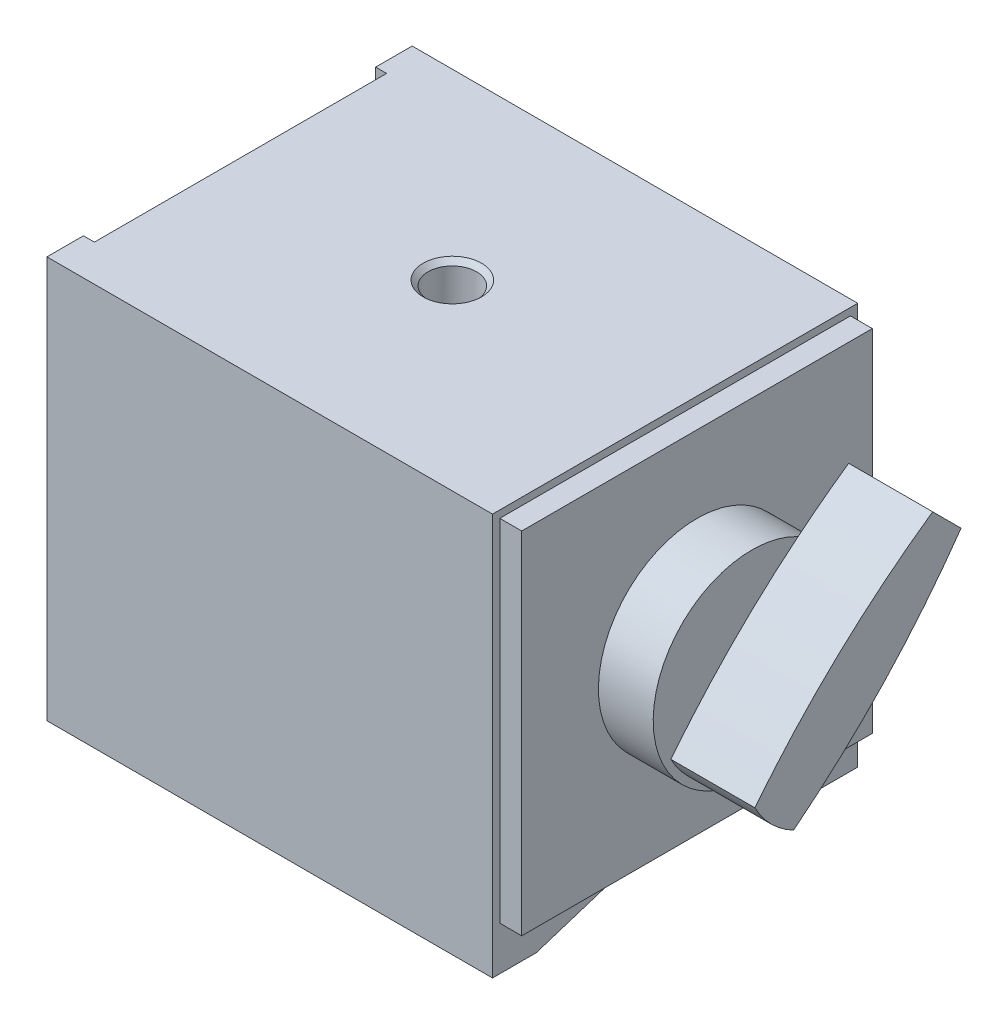
ISO-10303-21;
HEADER;
FILE_DESCRIPTION(('STEP AP214'),'2;1');
FILE_NAME('part.step','',(''),(''),'','','');
FILE_SCHEMA(('AUTOMOTIVE_DESIGN { 1 0 10303 214 1 1 1 1 }'));
ENDSEC;
DATA;
#1=APPLICATION_CONTEXT('core data for automotive mechanical design processes');
#2=APPLICATION_PROTOCOL_DEFINITION('international standard','automotive_design',2000,#1);
#3=PRODUCT_CONTEXT('',#1,'mechanical');
#4=PRODUCT('Part','Part','',(#3));
#5=PRODUCT_RELATED_PRODUCT_CATEGORY('part','',(#4));
#6=PRODUCT_DEFINITION_FORMATION('','',#4);
#7=PRODUCT_DEFINITION_CONTEXT('part definition',#1,'design');
#8=PRODUCT_DEFINITION('design','',#6,#7);
#9=PRODUCT_DEFINITION_SHAPE('','',#8);
#10=(LENGTH_UNIT() NAMED_UNIT(*) SI_UNIT(.MILLI.,.METRE.));
#11=(NAMED_UNIT(*) PLANE_ANGLE_UNIT() SI_UNIT($,.RADIAN.));
#12=(NAMED_UNIT(*) SI_UNIT($,.STERADIAN.) SOLID_ANGLE_UNIT());
#13=UNCERTAINTY_MEASURE_WITH_UNIT(LENGTH_MEASURE(1.E-05),#10,'distance_accuracy_value','');
#14=(GEOMETRIC_REPRESENTATION_CONTEXT(3) GLOBAL_UNCERTAINTY_ASSIGNED_CONTEXT((#13)) GLOBAL_UNIT_ASSIGNED_CONTEXT((#10,
#11,#12)) REPRESENTATION_CONTEXT('',''));
#15=CARTESIAN_POINT('',(0.,0.,0.));
#16=DIRECTION('',(0.,0.,1.));
#17=DIRECTION('',(1.,0.,0.));
#18=AXIS2_PLACEMENT_3D('',#15,#16,#17);
#19=CARTESIAN_POINT('',(-29.,0.,20.));
#20=DIRECTION('',(-1.,0.,0.));
#21=DIRECTION('',(0.,1.,0.));
#22=AXIS2_PLACEMENT_3D('',#19,#20,#21);
#23=PLANE('',#22);
#24=DIRECTION('',(0.,-0.304775727103784,0.952424147199324));
#25=VECTOR('',#24,1.);
#26=CARTESIAN_POINT('',(-29.,4.00000000000001,6.5));
#27=LINE('',#26,#25);
#28=CARTESIAN_POINT('',(-29.,0.,19.));
#29=VERTEX_POINT('',#28);
#30=CARTESIAN_POINT('',(-29.,4.00000000000001,6.5));
#31=VERTEX_POINT('',#30);
#32=EDGE_CURVE('E175',#29,#31,#27,.F.);
#33=ORIENTED_EDGE('',*,*,#32,.F.);
#34=DIRECTION('',(0.,0.,1.));
#35=VECTOR('',#34,1.);
#36=CARTESIAN_POINT('',(-29.,0.,19.));
#37=LINE('',#36,#35);
#38=CARTESIAN_POINT('',(-29.,0.,20.));
#39=VERTEX_POINT('',#38);
#40=EDGE_CURVE('E190',#29,#39,#37,.T.);
#41=ORIENTED_EDGE('',*,*,#40,.T.);
#42=DIRECTION('',(0.,1.,0.));
#43=VECTOR('',#42,1.);
#44=CARTESIAN_POINT('',(-29.,0.,20.));
#45=LINE('',#44,#43);
#46=CARTESIAN_POINT('',(-29.,55.,20.));
#47=VERTEX_POINT('',#46);
#48=EDGE_CURVE('E199',#47,#39,#45,.F.);
#49=ORIENTED_EDGE('',*,*,#48,.F.);
#50=DIRECTION('',(0.,0.,-1.));
#51=VECTOR('',#50,1.);
#52=CARTESIAN_POINT('',(-29.,55.,20.));
#53=LINE('',#52,#51);
#54=CARTESIAN_POINT('',(-29.,55.,-20.));
#55=VERTEX_POINT('',#54);
#56=EDGE_CURVE('E201',#55,#47,#53,.F.);
#57=ORIENTED_EDGE('',*,*,#56,.F.);
#58=DIRECTION('',(0.,-1.,0.));
#59=VECTOR('',#58,1.);
#60=CARTESIAN_POINT('',(-29.,55.,-20.));
#61=LINE('',#60,#59);
#62=CARTESIAN_POINT('',(-29.,0.,-20.));
#63=VERTEX_POINT('',#62);
#64=EDGE_CURVE('E211',#55,#63,#61,.T.);
#65=ORIENTED_EDGE('',*,*,#64,.T.);
#66=DIRECTION('',(0.,0.,1.));
#67=VECTOR('',#66,1.);
#68=CARTESIAN_POINT('',(-29.,0.,-20.));
#69=LINE('',#68,#67);
#70=CARTESIAN_POINT('',(-29.,0.,-19.));
#71=VERTEX_POINT('',#70);
#72=EDGE_CURVE('E216',#63,#71,#69,.T.);
#73=ORIENTED_EDGE('',*,*,#72,.T.);
#74=DIRECTION('',(0.,0.304775727103784,0.952424147199324));
#75=VECTOR('',#74,1.);
#76=CARTESIAN_POINT('',(-29.,0.,-19.));
#77=LINE('',#76,#75);
#78=CARTESIAN_POINT('',(-29.,3.99999999999999,-6.5));
#79=VERTEX_POINT('',#78);
#80=EDGE_CURVE('E221',#79,#71,#77,.F.);
#81=ORIENTED_EDGE('',*,*,#80,.F.);
#82=DIRECTION('',(0.,1.,0.));
#83=VECTOR('',#82,1.);
#84=CARTESIAN_POINT('',(-29.,4.,-6.5));
#85=LINE('',#84,#83);
#86=CARTESIAN_POINT('',(-29.,5.,-6.5));
#87=VERTEX_POINT('',#86);
#88=EDGE_CURVE('E225',#87,#79,#85,.F.);
#89=ORIENTED_EDGE('',*,*,#88,.F.);
#90=DIRECTION('',(0.,0.,1.));
#91=VECTOR('',#90,1.);
#92=CARTESIAN_POINT('',(-29.,5.,-6.5));
#93=LINE('',#92,#91);
#94=CARTESIAN_POINT('',(-29.,5.,6.5));
#95=VERTEX_POINT('',#94);
#96=EDGE_CURVE('E230',#95,#87,#93,.F.);
#97=ORIENTED_EDGE('',*,*,#96,.F.);
#98=DIRECTION('',(0.,-1.,0.));
#99=VECTOR('',#98,1.);
#100=CARTESIAN_POINT('',(-29.,5.,6.5));
#101=LINE('',#100,#99);
#102=EDGE_CURVE('E192',#31,#95,#101,.F.);
#103=ORIENTED_EDGE('',*,*,#102,.F.);
#104=EDGE_LOOP('',(#33,#41,#49,#57,#65,#73,#81,#89,#97,#103));
#105=FACE_BOUND('',#104,.T.);
#106=ADVANCED_FACE('F17',(#105),#23,.T.);
#107=CARTESIAN_POINT('',(30.5,0.,-25.));
#108=DIRECTION('',(1.,0.,0.));
#109=DIRECTION('',(0.,1.,0.));
#110=AXIS2_PLACEMENT_3D('',#107,#108,#109);
#111=PLANE('',#110);
#112=DIRECTION('',(0.,0.304775727103784,-0.952424147199324));
#113=VECTOR('',#112,1.);
#114=CARTESIAN_POINT('',(30.5,0.,19.));
#115=LINE('',#114,#113);
#116=CARTESIAN_POINT('',(30.5,4.,6.49999999999999));
#117=VERTEX_POINT('',#116);
#118=CARTESIAN_POINT('',(30.5,0.,19.));
#119=VERTEX_POINT('',#118);
#120=EDGE_CURVE('E178',#117,#119,#115,.F.);
#121=ORIENTED_EDGE('',*,*,#120,.F.);
#122=DIRECTION('',(0.,1.,0.));
#123=VECTOR('',#122,1.);
#124=CARTESIAN_POINT('',(30.5,4.,6.5));
#125=LINE('',#124,#123);
#126=CARTESIAN_POINT('',(30.5,5.,6.5));
#127=VERTEX_POINT('',#126);
#128=EDGE_CURVE('E240',#127,#117,#125,.F.);
#129=ORIENTED_EDGE('',*,*,#128,.F.);
#130=DIRECTION('',(0.,0.,-1.));
#131=VECTOR('',#130,1.);
#132=CARTESIAN_POINT('',(30.5,5.,6.5));
#133=LINE('',#132,#131);
#134=CARTESIAN_POINT('',(30.5,5.,-6.5));
#135=VERTEX_POINT('',#134);
#136=EDGE_CURVE('E245',#135,#127,#133,.F.);
#137=ORIENTED_EDGE('',*,*,#136,.F.);
#138=DIRECTION('',(0.,-1.,0.));
#139=VECTOR('',#138,1.);
#140=CARTESIAN_POINT('',(30.5,5.,-6.5));
#141=LINE('',#140,#139);
#142=CARTESIAN_POINT('',(30.5,4.,-6.5));
#143=VERTEX_POINT('',#142);
#144=EDGE_CURVE('E250',#143,#135,#141,.F.);
#145=ORIENTED_EDGE('',*,*,#144,.F.);
#146=DIRECTION('',(0.,-0.304775727103784,-0.952424147199324));
#147=VECTOR('',#146,1.);
#148=CARTESIAN_POINT('',(30.5,4.00000000000001,-6.5));
#149=LINE('',#148,#147);
#150=CARTESIAN_POINT('',(30.5,0.,-19.));
#151=VERTEX_POINT('',#150);
#152=EDGE_CURVE('E255',#151,#143,#149,.F.);
#153=ORIENTED_EDGE('',*,*,#152,.F.);
#154=DIRECTION('',(0.,0.,-1.));
#155=VECTOR('',#154,1.);
#156=CARTESIAN_POINT('',(30.5,0.,-19.));
#157=LINE('',#156,#155);
#158=CARTESIAN_POINT('',(30.5,0.,-25.));
#159=VERTEX_POINT('',#158);
#160=EDGE_CURVE('E259',#151,#159,#157,.T.);
#161=ORIENTED_EDGE('',*,*,#160,.T.);
#162=DIRECTION('',(0.,1.,0.));
#163=VECTOR('',#162,1.);
#164=CARTESIAN_POINT('',(30.5,0.,-25.));
#165=LINE('',#164,#163);
#166=CARTESIAN_POINT('',(30.5,55.,-25.));
#167=VERTEX_POINT('',#166);
#168=EDGE_CURVE('E264',#167,#159,#165,.F.);
#169=ORIENTED_EDGE('',*,*,#168,.F.);
#170=DIRECTION('',(0.,0.,1.));
#171=VECTOR('',#170,1.);
#172=CARTESIAN_POINT('',(30.5,55.,-25.));
#173=LINE('',#172,#171);
#174=CARTESIAN_POINT('',(30.5,55.,25.));
#175=VERTEX_POINT('',#174);
#176=EDGE_CURVE('E268',#175,#167,#173,.F.);
#177=ORIENTED_EDGE('',*,*,#176,.F.);
#178=DIRECTION('',(0.,-1.,0.));
#179=VECTOR('',#178,1.);
#180=CARTESIAN_POINT('',(30.5,55.,25.));
#181=LINE('',#180,#179);
#182=CARTESIAN_POINT('',(30.5,0.,25.));
#183=VERTEX_POINT('',#182);
#184=EDGE_CURVE('E272',#175,#183,#181,.T.);
#185=ORIENTED_EDGE('',*,*,#184,.T.);
#186=DIRECTION('',(0.,0.,-1.));
#187=VECTOR('',#186,1.);
#188=CARTESIAN_POINT('',(30.5,0.,25.));
#189=LINE('',#188,#187);
#190=EDGE_CURVE('E277',#183,#119,#189,.T.);
#191=ORIENTED_EDGE('',*,*,#190,.T.);
#192=EDGE_LOOP('',(#121,#129,#137,#145,#153,#161,#169,#177,#185,#191));
#193=FACE_BOUND('',#192,.T.);
#194=DIRECTION('',(0.,0.,-1.));
#195=VECTOR('',#194,1.);
#196=CARTESIAN_POINT('',(30.5,54.,24.));
#197=LINE('',#196,#195);
#198=CARTESIAN_POINT('',(30.5,54.,24.));
#199=VERTEX_POINT('',#198);
#200=CARTESIAN_POINT('',(30.5,54.,-24.));
#201=VERTEX_POINT('',#200);
#202=EDGE_CURVE('E281',#199,#201,#197,.T.);
#203=ORIENTED_EDGE('',*,*,#202,.T.);
#204=DIRECTION('',(0.,-1.,0.));
#205=VECTOR('',#204,1.);
#206=CARTESIAN_POINT('',(30.5,54.,-24.));
#207=LINE('',#206,#205);
#208=CARTESIAN_POINT('',(30.5,6.,-24.));
#209=VERTEX_POINT('',#208);
#210=EDGE_CURVE('E286',#201,#209,#207,.T.);
#211=ORIENTED_EDGE('',*,*,#210,.T.);
#212=DIRECTION('',(0.,0.,1.));
#213=VECTOR('',#212,1.);
#214=CARTESIAN_POINT('',(30.5,6.,-24.));
#215=LINE('',#214,#213);
#216=CARTESIAN_POINT('',(30.5,6.,24.));
#217=VERTEX_POINT('',#216);
#218=EDGE_CURVE('E291',#217,#209,#215,.F.);
#219=ORIENTED_EDGE('',*,*,#218,.F.);
#220=DIRECTION('',(0.,1.,0.));
#221=VECTOR('',#220,1.);
#222=CARTESIAN_POINT('',(30.5,6.,24.));
#223=LINE('',#222,#221);
#224=EDGE_CURVE('E184',#199,#217,#223,.F.);
#225=ORIENTED_EDGE('',*,*,#224,.F.);
#226=EDGE_LOOP('',(#203,#211,#219,#225));
#227=FACE_BOUND('',#226,.T.);
#228=ADVANCED_FACE('F536',(#193,#227),#111,.T.);
#229=CARTESIAN_POINT('',(-30.5,0.,19.));
#230=DIRECTION('',(0.,-1.,0.));
#231=DIRECTION('',(1.,0.,0.));
#232=AXIS2_PLACEMENT_3D('',#229,#230,#231);
#233=PLANE('',#232);
#234=DIRECTION('',(1.,0.,0.));
#235=VECTOR('',#234,1.);
#236=CARTESIAN_POINT('',(-29.,0.,19.));
#237=LINE('',#236,#235);
#238=EDGE_CURVE('E172',#119,#29,#237,.F.);
#239=ORIENTED_EDGE('',*,*,#238,.F.);
#240=ORIENTED_EDGE('',*,*,#190,.F.);
#241=DIRECTION('',(-1.,0.,0.));
#242=VECTOR('',#241,1.);
#243=CARTESIAN_POINT('',(30.5,0.,25.));
#244=LINE('',#243,#242);
#245=CARTESIAN_POINT('',(-30.5,0.,25.));
#246=VERTEX_POINT('',#245);
#247=EDGE_CURVE('E183',#246,#183,#244,.F.);
#248=ORIENTED_EDGE('',*,*,#247,.F.);
#249=DIRECTION('',(0.,0.,-1.));
#250=VECTOR('',#249,1.);
#251=CARTESIAN_POINT('',(-30.5,0.,25.));
#252=LINE('',#251,#250);
#253=CARTESIAN_POINT('',(-30.5,0.,20.));
#254=VERTEX_POINT('',#253);
#255=EDGE_CURVE('E304',#254,#246,#252,.F.);
#256=ORIENTED_EDGE('',*,*,#255,.F.);
#257=DIRECTION('',(1.,0.,0.));
#258=VECTOR('',#257,1.);
#259=CARTESIAN_POINT('',(-30.5,0.,20.));
#260=LINE('',#259,#258);
#261=EDGE_CURVE('E198',#39,#254,#260,.F.);
#262=ORIENTED_EDGE('',*,*,#261,.F.);
#263=ORIENTED_EDGE('',*,*,#40,.F.);
#264=EDGE_LOOP('',(#239,#240,#248,#256,#262,#263));
#265=FACE_BOUND('',#264,.T.);
#266=ADVANCED_FACE('F195',(#265),#233,.T.);
#267=CARTESIAN_POINT('',(-30.5,0.,-25.));
#268=DIRECTION('',(0.,-1.,0.));
#269=DIRECTION('',(1.,0.,0.));
#270=AXIS2_PLACEMENT_3D('',#267,#268,#269);
#271=PLANE('',#270);
#272=DIRECTION('',(-1.,0.,0.));
#273=VECTOR('',#272,1.);
#274=CARTESIAN_POINT('',(30.5,0.,-19.));
#275=LINE('',#274,#273);
#276=EDGE_CURVE('E312',#151,#71,#275,.T.);
#277=ORIENTED_EDGE('',*,*,#276,.T.);
#278=ORIENTED_EDGE('',*,*,#72,.F.);
#279=DIRECTION('',(-1.,0.,0.));
#280=VECTOR('',#279,1.);
#281=CARTESIAN_POINT('',(-29.,0.,-20.));
#282=LINE('',#281,#280);
#283=CARTESIAN_POINT('',(-30.5,0.,-20.));
#284=VERTEX_POINT('',#283);
#285=EDGE_CURVE('E317',#284,#63,#282,.F.);
#286=ORIENTED_EDGE('',*,*,#285,.F.);
#287=DIRECTION('',(0.,0.,-1.));
#288=VECTOR('',#287,1.);
#289=CARTESIAN_POINT('',(-30.5,0.,-20.));
#290=LINE('',#289,#288);
#291=CARTESIAN_POINT('',(-30.5,0.,-25.));
#292=VERTEX_POINT('',#291);
#293=EDGE_CURVE('E321',#292,#284,#290,.F.);
#294=ORIENTED_EDGE('',*,*,#293,.F.);
#295=DIRECTION('',(1.,0.,0.));
#296=VECTOR('',#295,1.);
#297=CARTESIAN_POINT('',(-30.5,0.,-25.));
#298=LINE('',#297,#296);
#299=EDGE_CURVE('E326',#159,#292,#298,.F.);
#300=ORIENTED_EDGE('',*,*,#299,.F.);
#301=ORIENTED_EDGE('',*,*,#160,.F.);
#302=EDGE_LOOP('',(#277,#278,#286,#294,#300,#301));
#303=FACE_BOUND('',#302,.T.);
#304=ADVANCED_FACE('F546',(#303),#271,.T.);
#305=CARTESIAN_POINT('',(-30.5,0.,-25.));
#306=DIRECTION('',(0.,0.,-1.));
#307=DIRECTION('',(0.,1.,0.));
#308=AXIS2_PLACEMENT_3D('',#305,#306,#307);
#309=PLANE('',#308);
#310=ORIENTED_EDGE('',*,*,#299,.T.);
#311=DIRECTION('',(0.,1.,0.));
#312=VECTOR('',#311,1.);
#313=CARTESIAN_POINT('',(-30.5,0.,-25.));
#314=LINE('',#313,#312);
#315=CARTESIAN_POINT('',(-30.5,55.,-25.));
#316=VERTEX_POINT('',#315);
#317=EDGE_CURVE('E331',#316,#292,#314,.F.);
#318=ORIENTED_EDGE('',*,*,#317,.F.);
#319=DIRECTION('',(1.,0.,0.));
#320=VECTOR('',#319,1.);
#321=CARTESIAN_POINT('',(-30.5,55.,-25.));
#322=LINE('',#321,#320);
#323=EDGE_CURVE('E335',#167,#316,#322,.F.);
#324=ORIENTED_EDGE('',*,*,#323,.F.);
#325=ORIENTED_EDGE('',*,*,#168,.T.);
#326=EDGE_LOOP('',(#310,#318,#324,#325));
#327=FACE_BOUND('',#326,.T.);
#328=ADVANCED_FACE('F549',(#327),#309,.T.);
#329=CARTESIAN_POINT('',(-30.5,0.,-20.));
#330=DIRECTION('',(-1.,0.,0.));
#331=DIRECTION('',(0.,1.,0.));
#332=AXIS2_PLACEMENT_3D('',#329,#330,#331);
#333=PLANE('',#332);
#334=ORIENTED_EDGE('',*,*,#293,.T.);
#335=DIRECTION('',(0.,1.,0.));
#336=VECTOR('',#335,1.);
#337=CARTESIAN_POINT('',(-30.5,0.,-20.));
#338=LINE('',#337,#336);
#339=CARTESIAN_POINT('',(-30.5,55.,-20.));
#340=VERTEX_POINT('',#339);
#341=EDGE_CURVE('E339',#340,#284,#338,.F.);
#342=ORIENTED_EDGE('',*,*,#341,.F.);
#343=DIRECTION('',(0.,0.,-1.));
#344=VECTOR('',#343,1.);
#345=CARTESIAN_POINT('',(-30.5,55.,-20.));
#346=LINE('',#345,#344);
#347=EDGE_CURVE('E343',#316,#340,#346,.F.);
#348=ORIENTED_EDGE('',*,*,#347,.F.);
#349=ORIENTED_EDGE('',*,*,#317,.T.);
#350=EDGE_LOOP('',(#334,#342,#348,#349));
#351=FACE_BOUND('',#350,.T.);
#352=ADVANCED_FACE('F553',(#351),#333,.T.);
#353=CARTESIAN_POINT('',(-29.,0.,-20.));
#354=DIRECTION('',(0.,0.,1.));
#355=DIRECTION('',(0.,1.,0.));
#356=AXIS2_PLACEMENT_3D('',#353,#354,#355);
#357=PLANE('',#356);
#358=ORIENTED_EDGE('',*,*,#285,.T.);
#359=ORIENTED_EDGE('',*,*,#64,.F.);
#360=DIRECTION('',(-1.,0.,0.));
#361=VECTOR('',#360,1.);
#362=CARTESIAN_POINT('',(-29.,55.,-20.));
#363=LINE('',#362,#361);
#364=EDGE_CURVE('E347',#340,#55,#363,.F.);
#365=ORIENTED_EDGE('',*,*,#364,.F.);
#366=ORIENTED_EDGE('',*,*,#341,.T.);
#367=EDGE_LOOP('',(#358,#359,#365,#366));
#368=FACE_BOUND('',#367,.T.);
#369=ADVANCED_FACE('F557',(#368),#357,.T.);
#370=CARTESIAN_POINT('',(-30.5,0.,20.));
#371=DIRECTION('',(0.,0.,-1.));
#372=DIRECTION('',(0.,1.,0.));
#373=AXIS2_PLACEMENT_3D('',#370,#371,#372);
#374=PLANE('',#373);
#375=ORIENTED_EDGE('',*,*,#261,.T.);
#376=DIRECTION('',(0.,1.,0.));
#377=VECTOR('',#376,1.);
#378=CARTESIAN_POINT('',(-30.5,0.,20.));
#379=LINE('',#378,#377);
#380=CARTESIAN_POINT('',(-30.5,55.,20.));
#381=VERTEX_POINT('',#380);
#382=EDGE_CURVE('E351',#381,#254,#379,.F.);
#383=ORIENTED_EDGE('',*,*,#382,.F.);
#384=DIRECTION('',(1.,0.,0.));
#385=VECTOR('',#384,1.);
#386=CARTESIAN_POINT('',(-30.5,55.,20.));
#387=LINE('',#386,#385);
#388=EDGE_CURVE('E355',#47,#381,#387,.F.);
#389=ORIENTED_EDGE('',*,*,#388,.F.);
#390=ORIENTED_EDGE('',*,*,#48,.T.);
#391=EDGE_LOOP('',(#375,#383,#389,#390));
#392=FACE_BOUND('',#391,.T.);
#393=ADVANCED_FACE('F561',(#392),#374,.T.);
#394=CARTESIAN_POINT('',(-30.5,0.,25.));
#395=DIRECTION('',(-1.,0.,0.));
#396=DIRECTION('',(0.,1.,0.));
#397=AXIS2_PLACEMENT_3D('',#394,#395,#396);
#398=PLANE('',#397);
#399=ORIENTED_EDGE('',*,*,#255,.T.);
#400=DIRECTION('',(0.,1.,0.));
#401=VECTOR('',#400,1.);
#402=CARTESIAN_POINT('',(-30.5,0.,25.));
#403=LINE('',#402,#401);
#404=CARTESIAN_POINT('',(-30.5,55.,25.));
#405=VERTEX_POINT('',#404);
#406=EDGE_CURVE('E359',#405,#246,#403,.F.);
#407=ORIENTED_EDGE('',*,*,#406,.F.);
#408=DIRECTION('',(0.,0.,-1.));
#409=VECTOR('',#408,1.);
#410=CARTESIAN_POINT('',(-30.5,55.,25.));
#411=LINE('',#410,#409);
#412=EDGE_CURVE('E363',#381,#405,#411,.F.);
#413=ORIENTED_EDGE('',*,*,#412,.F.);
#414=ORIENTED_EDGE('',*,*,#382,.T.);
#415=EDGE_LOOP('',(#399,#407,#413,#414));
#416=FACE_BOUND('',#415,.T.);
#417=ADVANCED_FACE('F565',(#416),#398,.T.);
#418=CARTESIAN_POINT('',(30.5,0.,25.));
#419=DIRECTION('',(0.,0.,1.));
#420=DIRECTION('',(0.,1.,0.));
#421=AXIS2_PLACEMENT_3D('',#418,#419,#420);
#422=PLANE('',#421);
#423=ORIENTED_EDGE('',*,*,#247,.T.);
#424=ORIENTED_EDGE('',*,*,#184,.F.);
#425=DIRECTION('',(-1.,0.,0.));
#426=VECTOR('',#425,1.);
#427=CARTESIAN_POINT('',(30.5,55.,25.));
#428=LINE('',#427,#426);
#429=EDGE_CURVE('E367',#405,#175,#428,.F.);
#430=ORIENTED_EDGE('',*,*,#429,.F.);
#431=ORIENTED_EDGE('',*,*,#406,.T.);
#432=EDGE_LOOP('',(#423,#424,#430,#431));
#433=FACE_BOUND('',#432,.T.);
#434=ADVANCED_FACE('F569',(#433),#422,.T.);
#435=CARTESIAN_POINT('',(-30.5,55.,-25.));
#436=DIRECTION('',(0.,1.,0.));
#437=DIRECTION('',(0.,0.,1.));
#438=AXIS2_PLACEMENT_3D('',#435,#436,#437);
#439=PLANE('',#438);
#440=ORIENTED_EDGE('',*,*,#323,.T.);
#441=ORIENTED_EDGE('',*,*,#347,.T.);
#442=ORIENTED_EDGE('',*,*,#364,.T.);
#443=ORIENTED_EDGE('',*,*,#56,.T.);
#444=ORIENTED_EDGE('',*,*,#388,.T.);
#445=ORIENTED_EDGE('',*,*,#412,.T.);
#446=ORIENTED_EDGE('',*,*,#429,.T.);
#447=ORIENTED_EDGE('',*,*,#176,.T.);
#448=EDGE_LOOP('',(#440,#441,#442,#443,#444,#445,#446,#447));
#449=FACE_BOUND('',#448,.T.);
#450=CARTESIAN_POINT('',(0.,55.,0.));
#451=DIRECTION('',(0.,-1.,0.));
#452=DIRECTION('',(-1.42053900198395E-07,0.,0.99999999999999));
#453=AXIS2_PLACEMENT_3D('',#450,#451,#452);
#454=CIRCLE('',#453,4.);
#455=CARTESIAN_POINT('',(-5.6821560079358E-07,55.,3.99999999999996));
#456=VERTEX_POINT('',#455);
#457=EDGE_CURVE('E371',#456,#456,#454,.T.);
#458=ORIENTED_EDGE('',*,*,#457,.T.);
#459=EDGE_LOOP('',(#458));
#460=FACE_BOUND('',#459,.T.);
#461=ADVANCED_FACE('F573',(#449,#460),#439,.T.);
#462=CARTESIAN_POINT('',(-3.3235,47.,-3.3235));
#463=DIRECTION('',(0.,1.,0.));
#464=DIRECTION('',(0.,0.,1.));
#465=AXIS2_PLACEMENT_3D('',#462,#463,#464);
#466=PLANE('',#465);
#467=CARTESIAN_POINT('',(0.,47.,0.));
#468=DIRECTION('',(0.,1.,0.));
#469=DIRECTION('',(0.,0.,-1.));
#470=AXIS2_PLACEMENT_3D('',#467,#468,#469);
#471=CIRCLE('',#470,3.3235);
#472=CARTESIAN_POINT('',(0.,47.,-3.3235));
#473=VERTEX_POINT('',#472);
#474=EDGE_CURVE('E376',#473,#473,#471,.F.);
#475=ORIENTED_EDGE('',*,*,#474,.F.);
#476=EDGE_LOOP('',(#475));
#477=FACE_BOUND('',#476,.T.);
#478=ADVANCED_FACE('F577',(#477),#466,.T.);
#479=CARTESIAN_POINT('',(-29.,4.,-6.5));
#480=DIRECTION('',(0.,0.,1.));
#481=DIRECTION('',(1.,0.,0.));
#482=AXIS2_PLACEMENT_3D('',#479,#480,#481);
#483=PLANE('',#482);
#484=ORIENTED_EDGE('',*,*,#88,.T.);
#485=DIRECTION('',(1.,0.,0.));
#486=VECTOR('',#485,1.);
#487=CARTESIAN_POINT('',(-29.,4.,-6.5));
#488=LINE('',#487,#486);
#489=EDGE_CURVE('E379',#143,#79,#488,.F.);
#490=ORIENTED_EDGE('',*,*,#489,.F.);
#491=ORIENTED_EDGE('',*,*,#144,.T.);
#492=DIRECTION('',(-1.,0.,0.));
#493=VECTOR('',#492,1.);
#494=CARTESIAN_POINT('',(30.5,5.,-6.5));
#495=LINE('',#494,#493);
#496=EDGE_CURVE('E381',#135,#87,#495,.T.);
#497=ORIENTED_EDGE('',*,*,#496,.T.);
#498=EDGE_LOOP('',(#484,#490,#491,#497));
#499=FACE_BOUND('',#498,.T.);
#500=ADVANCED_FACE('F581',(#499),#483,.T.);
#501=CARTESIAN_POINT('',(-29.,5.,6.5));
#502=DIRECTION('',(0.,-1.,0.));
#503=DIRECTION('',(0.,0.,-1.));
#504=AXIS2_PLACEMENT_3D('',#501,#502,#503);
#505=PLANE('',#504);
#506=ORIENTED_EDGE('',*,*,#96,.T.);
#507=ORIENTED_EDGE('',*,*,#496,.F.);
#508=ORIENTED_EDGE('',*,*,#136,.T.);
#509=DIRECTION('',(-1.,0.,0.));
#510=VECTOR('',#509,1.);
#511=CARTESIAN_POINT('',(30.5,5.,6.5));
#512=LINE('',#511,#510);
#513=EDGE_CURVE('E386',#127,#95,#512,.T.);
#514=ORIENTED_EDGE('',*,*,#513,.T.);
#515=EDGE_LOOP('',(#506,#507,#508,#514));
#516=FACE_BOUND('',#515,.T.);
#517=ADVANCED_FACE('F585',(#516),#505,.T.);
#518=CARTESIAN_POINT('',(30.5,4.,6.5));
#519=DIRECTION('',(0.,0.,-1.));
#520=DIRECTION('',(-1.,0.,0.));
#521=AXIS2_PLACEMENT_3D('',#518,#519,#520);
#522=PLANE('',#521);
#523=ORIENTED_EDGE('',*,*,#102,.T.);
#524=ORIENTED_EDGE('',*,*,#513,.F.);
#525=ORIENTED_EDGE('',*,*,#128,.T.);
#526=DIRECTION('',(-1.,0.,0.));
#527=VECTOR('',#526,1.);
#528=CARTESIAN_POINT('',(30.5,4.,6.5));
#529=LINE('',#528,#527);
#530=EDGE_CURVE('E391',#117,#31,#529,.T.);
#531=ORIENTED_EDGE('',*,*,#530,.T.);
#532=EDGE_LOOP('',(#523,#524,#525,#531));
#533=FACE_BOUND('',#532,.T.);
#534=ADVANCED_FACE('F589',(#533),#522,.T.);
#535=CARTESIAN_POINT('',(-29.,0.,19.));
#536=DIRECTION('',(0.,-0.952424147199324,-0.304775727103784));
#537=DIRECTION('',(0.,0.304775727103784,-0.952424147199324));
#538=AXIS2_PLACEMENT_3D('',#535,#536,#537);
#539=PLANE('',#538);
#540=ORIENTED_EDGE('',*,*,#32,.T.);
#541=ORIENTED_EDGE('',*,*,#530,.F.);
#542=ORIENTED_EDGE('',*,*,#120,.T.);
#543=ORIENTED_EDGE('',*,*,#238,.T.);
#544=EDGE_LOOP('',(#540,#541,#542,#543));
#545=FACE_BOUND('',#544,.T.);
#546=ADVANCED_FACE('F174',(#545),#539,.T.);
#547=CARTESIAN_POINT('',(-29.,4.,-6.5));
#548=DIRECTION('',(0.,-0.952424147199324,0.304775727103784));
#549=DIRECTION('',(0.,-0.304775727103784,-0.952424147199324));
#550=AXIS2_PLACEMENT_3D('',#547,#548,#549);
#551=PLANE('',#550);
#552=ORIENTED_EDGE('',*,*,#80,.T.);
#553=ORIENTED_EDGE('',*,*,#276,.F.);
#554=ORIENTED_EDGE('',*,*,#152,.T.);
#555=ORIENTED_EDGE('',*,*,#489,.T.);
#556=EDGE_LOOP('',(#552,#553,#554,#555));
#557=FACE_BOUND('',#556,.T.);
#558=ADVANCED_FACE('F596',(#557),#551,.T.);
#559=CARTESIAN_POINT('',(30.5,6.,-24.));
#560=DIRECTION('',(0.,-1.,0.));
#561=DIRECTION('',(1.,0.,0.));
#562=AXIS2_PLACEMENT_3D('',#559,#560,#561);
#563=PLANE('',#562);
#564=DIRECTION('',(1.,0.,0.));
#565=VECTOR('',#564,1.);
#566=CARTESIAN_POINT('',(30.5,6.,-24.));
#567=LINE('',#566,#565);
#568=CARTESIAN_POINT('',(33.5,6.,-24.));
#569=VERTEX_POINT('',#568);
#570=EDGE_CURVE('E395',#209,#569,#567,.T.);
#571=ORIENTED_EDGE('',*,*,#570,.T.);
#572=DIRECTION('',(0.,0.,1.));
#573=VECTOR('',#572,1.);
#574=CARTESIAN_POINT('',(33.5,6.,-24.));
#575=LINE('',#574,#573);
#576=CARTESIAN_POINT('',(33.5,6.,24.));
#577=VERTEX_POINT('',#576);
#578=EDGE_CURVE('E400',#577,#569,#575,.F.);
#579=ORIENTED_EDGE('',*,*,#578,.F.);
#580=DIRECTION('',(-1.,0.,0.));
#581=VECTOR('',#580,1.);
#582=CARTESIAN_POINT('',(33.5,6.,24.));
#583=LINE('',#582,#581);
#584=EDGE_CURVE('E405',#217,#577,#583,.F.);
#585=ORIENTED_EDGE('',*,*,#584,.F.);
#586=ORIENTED_EDGE('',*,*,#218,.T.);
#587=EDGE_LOOP('',(#571,#579,#585,#586));
#588=FACE_BOUND('',#587,.T.);
#589=ADVANCED_FACE('F599',(#588),#563,.T.);
#590=CARTESIAN_POINT('',(33.5,6.,-24.));
#591=DIRECTION('',(1.,0.,0.));
#592=DIRECTION('',(0.,1.,0.));
#593=AXIS2_PLACEMENT_3D('',#590,#591,#592);
#594=PLANE('',#593);
#595=DIRECTION('',(0.,1.,0.));
#596=VECTOR('',#595,1.);
#597=CARTESIAN_POINT('',(33.5,6.,-24.));
#598=LINE('',#597,#596);
#599=CARTESIAN_POINT('',(33.5,54.,-24.));
#600=VERTEX_POINT('',#599);
#601=EDGE_CURVE('E409',#569,#600,#598,.T.);
#602=ORIENTED_EDGE('',*,*,#601,.T.);
#603=DIRECTION('',(0.,0.,1.));
#604=VECTOR('',#603,1.);
#605=CARTESIAN_POINT('',(33.5,54.,-24.));
#606=LINE('',#605,#604);
#607=CARTESIAN_POINT('',(33.5,54.,24.));
#608=VERTEX_POINT('',#607);
#609=EDGE_CURVE('E414',#608,#600,#606,.F.);
#610=ORIENTED_EDGE('',*,*,#609,.F.);
#611=DIRECTION('',(0.,-1.,0.));
#612=VECTOR('',#611,1.);
#613=CARTESIAN_POINT('',(33.5,54.,24.));
#614=LINE('',#613,#612);
#615=EDGE_CURVE('E419',#577,#608,#614,.F.);
#616=ORIENTED_EDGE('',*,*,#615,.F.);
#617=ORIENTED_EDGE('',*,*,#578,.T.);
#618=EDGE_LOOP('',(#602,#610,#616,#617));
#619=FACE_BOUND('',#618,.T.);
#620=CARTESIAN_POINT('',(33.5,30.,0.));
#621=DIRECTION('',(-1.,0.,0.));
#622=DIRECTION('',(0.,0.,-1.));
#623=AXIS2_PLACEMENT_3D('',#620,#621,#622);
#624=CIRCLE('',#623,13.5);
#625=CARTESIAN_POINT('',(33.5,30.,-13.5));
#626=VERTEX_POINT('',#625);
#627=EDGE_CURVE('E423',#626,#626,#624,.F.);
#628=ORIENTED_EDGE('',*,*,#627,.F.);
#629=EDGE_LOOP('',(#628));
#630=FACE_BOUND('',#629,.T.);
#631=ADVANCED_FACE('F603',(#619,#630),#594,.T.);
#632=CARTESIAN_POINT('',(30.5,54.,24.));
#633=DIRECTION('',(0.,1.,0.));
#634=DIRECTION('',(1.,0.,0.));
#635=AXIS2_PLACEMENT_3D('',#632,#633,#634);
#636=PLANE('',#635);
#637=DIRECTION('',(-1.,0.,0.));
#638=VECTOR('',#637,1.);
#639=CARTESIAN_POINT('',(33.5,54.,-24.));
#640=LINE('',#639,#638);
#641=EDGE_CURVE('E428',#600,#201,#640,.T.);
#642=ORIENTED_EDGE('',*,*,#641,.T.);
#643=ORIENTED_EDGE('',*,*,#202,.F.);
#644=DIRECTION('',(1.,0.,0.));
#645=VECTOR('',#644,1.);
#646=CARTESIAN_POINT('',(30.5,54.,24.));
#647=LINE('',#646,#645);
#648=EDGE_CURVE('E431',#608,#199,#647,.F.);
#649=ORIENTED_EDGE('',*,*,#648,.F.);
#650=ORIENTED_EDGE('',*,*,#609,.T.);
#651=EDGE_LOOP('',(#642,#643,#649,#650));
#652=FACE_BOUND('',#651,.T.);
#653=ADVANCED_FACE('F607',(#652),#636,.T.);
#654=CARTESIAN_POINT('',(30.5,6.,24.));
#655=DIRECTION('',(0.,0.,1.));
#656=DIRECTION('',(1.,0.,0.));
#657=AXIS2_PLACEMENT_3D('',#654,#655,#656);
#658=PLANE('',#657);
#659=ORIENTED_EDGE('',*,*,#224,.T.);
#660=ORIENTED_EDGE('',*,*,#584,.T.);
#661=ORIENTED_EDGE('',*,*,#615,.T.);
#662=ORIENTED_EDGE('',*,*,#648,.T.);
#663=EDGE_LOOP('',(#659,#660,#661,#662));
#664=FACE_BOUND('',#663,.T.);
#665=ADVANCED_FACE('F611',(#664),#658,.T.);
#666=CARTESIAN_POINT('',(30.5,6.,-24.));
#667=DIRECTION('',(0.,0.,-1.));
#668=DIRECTION('',(0.,1.,0.));
#669=AXIS2_PLACEMENT_3D('',#666,#667,#668);
#670=PLANE('',#669);
#671=ORIENTED_EDGE('',*,*,#210,.F.);
#672=ORIENTED_EDGE('',*,*,#641,.F.);
#673=ORIENTED_EDGE('',*,*,#601,.F.);
#674=ORIENTED_EDGE('',*,*,#570,.F.);
#675=EDGE_LOOP('',(#671,#672,#673,#674));
#676=FACE_BOUND('',#675,.T.);
#677=ADVANCED_FACE('F615',(#676),#670,.T.);
#678=CARTESIAN_POINT('',(41.,16.2492193594724,-13.5));
#679=DIRECTION('',(1.,0.,0.));
#680=DIRECTION('',(0.,1.,0.));
#681=AXIS2_PLACEMENT_3D('',#678,#679,#680);
#682=PLANE('',#681);
#683=CARTESIAN_POINT('',(41.,-46.9065337179159,-78.8792454642011));
#684=DIRECTION('',(-1.,0.,0.));
#685=DIRECTION('',(0.,0.620199363073218,0.784444230040335));
#686=AXIS2_PLACEMENT_3D('',#683,#684,#685);
#687=CIRCLE('',#686,114.683241236978);
#688=CARTESIAN_POINT('',(41.,41.9195214042567,-6.33837593500643));
#689=VERTEX_POINT('',#688);
#690=CARTESIAN_POINT('',(41.,24.2199394524301,11.0833614064701));
#691=VERTEX_POINT('',#690);
#692=EDGE_CURVE('E435',#689,#691,#687,.F.);
#693=ORIENTED_EDGE('',*,*,#692,.F.);
#694=CARTESIAN_POINT('',(41.,30.,0.));
#695=DIRECTION('',(1.,0.,0.));
#696=DIRECTION('',(0.,0.,-1.));
#697=AXIS2_PLACEMENT_3D('',#694,#695,#696);
#698=CIRCLE('',#697,13.5);
#699=CARTESIAN_POINT('',(41.,36.3383759350065,-11.9195214042566));
#700=VERTEX_POINT('',#699);
#701=EDGE_CURVE('E440',#689,#700,#698,.T.);
#702=ORIENTED_EDGE('',*,*,#701,.T.);
#703=CARTESIAN_POINT('',(41.,108.879245464199,76.9065337179118));
#704=DIRECTION('',(-1.,0.,0.));
#705=DIRECTION('',(0.,-0.63253243234815,-0.774533874035044));
#706=AXIS2_PLACEMENT_3D('',#703,#704,#705);
#707=CIRCLE('',#706,114.683241236973);
#708=CARTESIAN_POINT('',(41.,18.91663859353,5.78006054757049));
#709=VERTEX_POINT('',#708);
#710=EDGE_CURVE('E445',#709,#700,#707,.F.);
#711=ORIENTED_EDGE('',*,*,#710,.F.);
#712=CARTESIAN_POINT('',(41.,29.9999999999994,1.16920362280837E-12));
#713=DIRECTION('',(-1.,0.,0.));
#714=DIRECTION('',(0.,-0.886668912517601,0.462404843805571));
#715=AXIS2_PLACEMENT_3D('',#712,#713,#714);
#716=CIRCLE('',#715,12.4999999999989);
#717=EDGE_CURVE('E450',#691,#709,#716,.F.);
#718=ORIENTED_EDGE('',*,*,#717,.F.);
#719=EDGE_LOOP('',(#693,#702,#711,#718));
#720=FACE_BOUND('',#719,.T.);
#721=ADVANCED_FACE('F514',(#720),#682,.T.);
#722=CARTESIAN_POINT('',(52.5,-46.9065337179159,-78.8792454642011));
#723=DIRECTION('',(-1.,0.,0.));
#724=DIRECTION('',(0.,0.620199363073218,0.784444230040335));
#725=AXIS2_PLACEMENT_3D('',#722,#723,#724);
#726=CYLINDRICAL_SURFACE('',#725,114.683241236978);
#727=CARTESIAN_POINT('',(41.,-46.9065337179159,-78.8792454642011));
#728=DIRECTION('',(1.,0.,0.));
#729=DIRECTION('',(0.,0.820118721333834,0.572193396429701));
#730=AXIS2_PLACEMENT_3D('',#727,#728,#729);
#731=CIRCLE('',#730,114.683241236978);
#732=CARTESIAN_POINT('',(41.,47.1473394437741,-13.2582521472479));
#733=VERTEX_POINT('',#732);
#734=EDGE_CURVE('E455',#733,#689,#731,.T.);
#735=ORIENTED_EDGE('',*,*,#734,.T.);
#736=ORIENTED_EDGE('',*,*,#692,.T.);
#737=DIRECTION('',(1.,0.,0.));
#738=VECTOR('',#737,1.);
#739=CARTESIAN_POINT('',(41.,24.2199394524301,11.0833614064701));
#740=LINE('',#739,#738);
#741=CARTESIAN_POINT('',(52.5,24.2199394524301,11.0833614064701));
#742=VERTEX_POINT('',#741);
#743=EDGE_CURVE('E460',#742,#691,#740,.F.);
#744=ORIENTED_EDGE('',*,*,#743,.F.);
#745=CARTESIAN_POINT('',(52.5,-46.9065337179159,-78.8792454642011));
#746=DIRECTION('',(-1.,0.,0.));
#747=DIRECTION('',(0.,0.620199363073219,0.784444230040335));
#748=AXIS2_PLACEMENT_3D('',#745,#746,#747);
#749=CIRCLE('',#748,114.683241236978);
#750=CARTESIAN_POINT('',(52.5,47.1473394437741,-13.2582521472478));
#751=VERTEX_POINT('',#750);
#752=EDGE_CURVE('E464',#751,#742,#749,.F.);
#753=ORIENTED_EDGE('',*,*,#752,.F.);
#754=DIRECTION('',(-1.,0.,0.));
#755=VECTOR('',#754,1.);
#756=CARTESIAN_POINT('',(52.5,47.1473394437741,-13.2582521472479));
#757=LINE('',#756,#755);
#758=EDGE_CURVE('E468',#751,#733,#757,.T.);
#759=ORIENTED_EDGE('',*,*,#758,.T.);
#760=EDGE_LOOP('',(#735,#736,#744,#753,#759));
#761=FACE_BOUND('',#760,.T.);
#762=ADVANCED_FACE('F508',(#761),#726,.T.);
#763=CARTESIAN_POINT('',(52.5,29.9999999999994,1.16920362280837E-12));
#764=DIRECTION('',(-1.,0.,0.));
#765=DIRECTION('',(0.,-0.886668912517601,0.462404843805571));
#766=AXIS2_PLACEMENT_3D('',#763,#764,#765);
#767=CYLINDRICAL_SURFACE('',#766,12.4999999999989);
#768=ORIENTED_EDGE('',*,*,#717,.T.);
#769=DIRECTION('',(1.,0.,0.));
#770=VECTOR('',#769,1.);
#771=CARTESIAN_POINT('',(41.,18.9166385935304,5.78006054757026));
#772=LINE('',#771,#770);
#773=CARTESIAN_POINT('',(52.5,18.9166385935304,5.78006054757023));
#774=VERTEX_POINT('',#773);
#775=EDGE_CURVE('E473',#774,#709,#772,.F.);
#776=ORIENTED_EDGE('',*,*,#775,.F.);
#777=CARTESIAN_POINT('',(52.5,29.9999999999994,1.16920362280837E-12));
#778=DIRECTION('',(-1.,0.,0.));
#779=DIRECTION('',(0.,-0.886668912517603,0.462404843805567));
#780=AXIS2_PLACEMENT_3D('',#777,#778,#779);
#781=CIRCLE('',#780,12.4999999999989);
#782=EDGE_CURVE('E477',#742,#774,#781,.F.);
#783=ORIENTED_EDGE('',*,*,#782,.F.);
#784=ORIENTED_EDGE('',*,*,#743,.T.);
#785=EDGE_LOOP('',(#768,#776,#783,#784));
#786=FACE_BOUND('',#785,.T.);
#787=ADVANCED_FACE('F518',(#786),#767,.T.);
#788=CARTESIAN_POINT('',(52.5,108.879245464199,76.9065337179118));
#789=DIRECTION('',(-1.,0.,0.));
#790=DIRECTION('',(0.,-0.572193396429704,-0.820118721333832));
#791=AXIS2_PLACEMENT_3D('',#788,#789,#790);
#792=CYLINDRICAL_SURFACE('',#791,114.683241236973);
#793=ORIENTED_EDGE('',*,*,#710,.T.);
#794=CARTESIAN_POINT('',(41.,108.879245464199,76.9065337179118));
#795=DIRECTION('',(1.,0.,0.));
#796=DIRECTION('',(0.,-0.63253243234815,-0.774533874035044));
#797=AXIS2_PLACEMENT_3D('',#794,#795,#796);
#798=CIRCLE('',#797,114.683241236973);
#799=CARTESIAN_POINT('',(41.,43.258252147248,-17.147339443774));
#800=VERTEX_POINT('',#799);
#801=EDGE_CURVE('E481',#700,#800,#798,.T.);
#802=ORIENTED_EDGE('',*,*,#801,.T.);
#803=DIRECTION('',(1.,0.,0.));
#804=VECTOR('',#803,1.);
#805=CARTESIAN_POINT('',(41.,43.258252147248,-17.147339443774));
#806=LINE('',#805,#804);
#807=CARTESIAN_POINT('',(52.5,43.258252147248,-17.147339443774));
#808=VERTEX_POINT('',#807);
#809=EDGE_CURVE('E485',#808,#800,#806,.F.);
#810=ORIENTED_EDGE('',*,*,#809,.F.);
#811=CARTESIAN_POINT('',(52.5,108.879245464199,76.9065337179118));
#812=DIRECTION('',(-1.,0.,0.));
#813=DIRECTION('',(0.,-0.572193396429704,-0.820118721333832));
#814=AXIS2_PLACEMENT_3D('',#811,#812,#813);
#815=CIRCLE('',#814,114.683241236973);
#816=EDGE_CURVE('E32',#774,#808,#815,.F.);
#817=ORIENTED_EDGE('',*,*,#816,.F.);
#818=ORIENTED_EDGE('',*,*,#775,.T.);
#819=EDGE_LOOP('',(#793,#802,#810,#817,#818));
#820=FACE_BOUND('',#819,.T.);
#821=ADVANCED_FACE('F524',(#820),#792,.T.);
#822=CARTESIAN_POINT('',(41.,47.1473394437741,-13.2582521472479));
#823=DIRECTION('',(0.,0.707106781186548,-0.707106781186547));
#824=DIRECTION('',(1.,0.,0.));
#825=AXIS2_PLACEMENT_3D('',#822,#823,#824);
#826=PLANE('',#825);
#827=DIRECTION('',(0.,0.707106781186547,0.707106781186548));
#828=VECTOR('',#827,1.);
#829=CARTESIAN_POINT('',(41.,43.258252147248,-17.147339443774));
#830=LINE('',#829,#828);
#831=EDGE_CURVE('E40',#800,#733,#830,.T.);
#832=ORIENTED_EDGE('',*,*,#831,.T.);
#833=ORIENTED_EDGE('',*,*,#758,.F.);
#834=DIRECTION('',(0.,-0.707106781186547,-0.707106781186548));
#835=VECTOR('',#834,1.);
#836=CARTESIAN_POINT('',(52.5,47.1473394437741,-13.2582521472479));
#837=LINE('',#836,#835);
#838=EDGE_CURVE('E496',#808,#751,#837,.F.);
#839=ORIENTED_EDGE('',*,*,#838,.F.);
#840=ORIENTED_EDGE('',*,*,#809,.T.);
#841=EDGE_LOOP('',(#832,#833,#839,#840));
#842=FACE_BOUND('',#841,.T.);
#843=ADVANCED_FACE('F521',(#842),#826,.T.);
#844=CARTESIAN_POINT('',(52.5,18.9166385935303,11.0833614064701));
#845=DIRECTION('',(1.,0.,0.));
#846=DIRECTION('',(0.,0.,-1.));
#847=AXIS2_PLACEMENT_3D('',#844,#845,#846);
#848=PLANE('',#847);
#849=ORIENTED_EDGE('',*,*,#752,.T.);
#850=ORIENTED_EDGE('',*,*,#782,.T.);
#851=ORIENTED_EDGE('',*,*,#816,.T.);
#852=ORIENTED_EDGE('',*,*,#838,.T.);
#853=EDGE_LOOP('',(#849,#850,#851,#852));
#854=FACE_BOUND('',#853,.T.);
#855=ADVANCED_FACE('F532',(#854),#848,.T.);
#856=CARTESIAN_POINT('',(41.,36.3383759350065,-6.33837593500641));
#857=DIRECTION('',(-1.,0.,0.));
#858=DIRECTION('',(0.,1.,0.));
#859=AXIS2_PLACEMENT_3D('',#856,#857,#858);
#860=PLANE('',#859);
#861=ORIENTED_EDGE('',*,*,#801,.F.);
#862=CARTESIAN_POINT('',(41.,30.,0.));
#863=DIRECTION('',(1.,0.,0.));
#864=DIRECTION('',(0.,0.469509328519001,-0.882927511426412));
#865=AXIS2_PLACEMENT_3D('',#862,#863,#864);
#866=CIRCLE('',#865,13.5);
#867=EDGE_CURVE('E25',#700,#689,#866,.T.);
#868=ORIENTED_EDGE('',*,*,#867,.T.);
#869=ORIENTED_EDGE('',*,*,#734,.F.);
#870=ORIENTED_EDGE('',*,*,#831,.F.);
#871=EDGE_LOOP('',(#861,#868,#869,#870));
#872=FACE_BOUND('',#871,.T.);
#873=ADVANCED_FACE('F504',(#872),#860,.T.);
#874=CARTESIAN_POINT('',(0.,55.,0.));
#875=DIRECTION('',(0.,1.,0.));
#876=DIRECTION('',(0.,0.,-1.));
#877=AXIS2_PLACEMENT_3D('',#874,#875,#876);
#878=CONICAL_SURFACE('',#877,4.,0.785398163397451);
#879=ORIENTED_EDGE('',*,*,#457,.F.);
#880=EDGE_LOOP('',(#879));
#881=FACE_BOUND('',#880,.T.);
#882=CARTESIAN_POINT('',(0.,54.3235,0.));
#883=DIRECTION('',(0.,-1.,0.));
#884=DIRECTION('',(0.,0.,1.));
#885=AXIS2_PLACEMENT_3D('',#882,#883,#884);
#886=CIRCLE('',#885,3.32349999999999);
#887=CARTESIAN_POINT('',(0.,54.3235,3.32349999999999));
#888=VERTEX_POINT('',#887);
#889=EDGE_CURVE('E11',#888,#888,#886,.T.);
#890=ORIENTED_EDGE('',*,*,#889,.T.);
#891=EDGE_LOOP('',(#890));
#892=FACE_BOUND('',#891,.T.);
#893=ADVANCED_FACE('F663',(#881,#892),#878,.F.);
#894=CARTESIAN_POINT('',(0.,47.,0.));
#895=DIRECTION('',(0.,-1.,0.));
#896=DIRECTION('',(0.,0.,1.));
#897=AXIS2_PLACEMENT_3D('',#894,#895,#896);
#898=CYLINDRICAL_SURFACE('',#897,3.3235);
#899=ORIENTED_EDGE('',*,*,#474,.T.);
#900=EDGE_LOOP('',(#899));
#901=FACE_BOUND('',#900,.T.);
#902=ORIENTED_EDGE('',*,*,#889,.F.);
#903=EDGE_LOOP('',(#902));
#904=FACE_BOUND('',#903,.T.);
#905=ADVANCED_FACE('F672',(#901,#904),#898,.F.);
#906=CARTESIAN_POINT('',(41.,30.,0.));
#907=DIRECTION('',(1.,0.,0.));
#908=DIRECTION('',(0.,0.,1.));
#909=AXIS2_PLACEMENT_3D('',#906,#907,#908);
#910=CYLINDRICAL_SURFACE('',#909,13.5);
#911=ORIENTED_EDGE('',*,*,#627,.T.);
#912=EDGE_LOOP('',(#911));
#913=FACE_BOUND('',#912,.T.);
#914=ORIENTED_EDGE('',*,*,#867,.F.);
#915=ORIENTED_EDGE('',*,*,#701,.F.);
#916=EDGE_LOOP('',(#914,#915));
#917=FACE_BOUND('',#916,.T.);
#918=ADVANCED_FACE('F19',(#913,#917),#910,.T.);
#919=CLOSED_SHELL('',(#106,#228,#266,#304,#328,#352,#369,#393,#417,#434,#461,#478,#500,#517,
#534,#546,#558,#589,#631,#653,#665,#677,#721,#762,#787,#821,#843,#855,#873,#893,#905,#918));
#920=MANIFOLD_SOLID_BREP('B1',#919);
#921=ADVANCED_BREP_SHAPE_REPRESENTATION('',(#18,#920),#14);
#922=SHAPE_DEFINITION_REPRESENTATION(#9,#921);
ENDSEC;
END-ISO-10303-21;
